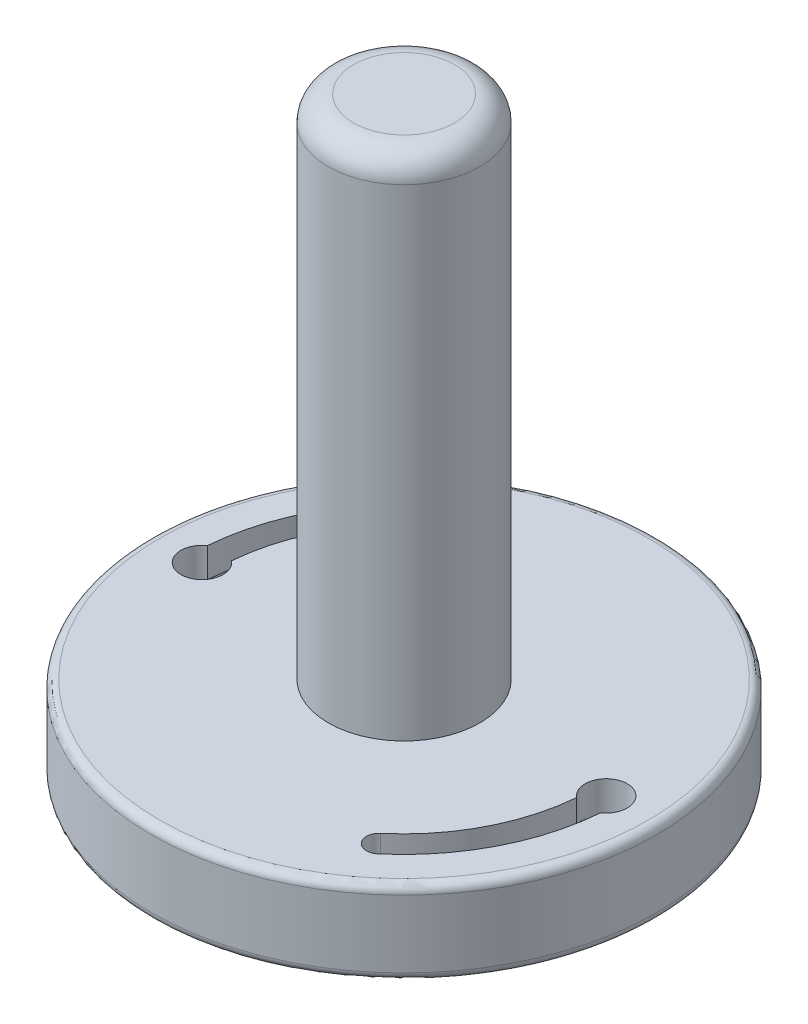
ISO-10303-21;
HEADER;
FILE_DESCRIPTION(('STEP AP214'),'2;1');
FILE_NAME('part.step','',(''),(''),'','','');
FILE_SCHEMA(('AUTOMOTIVE_DESIGN { 1 0 10303 214 1 1 1 1 }'));
ENDSEC;
DATA;
#1=APPLICATION_CONTEXT('core data for automotive mechanical design processes');
#2=APPLICATION_PROTOCOL_DEFINITION('international standard','automotive_design',2000,#1);
#3=PRODUCT_CONTEXT('',#1,'mechanical');
#4=PRODUCT('Part','Part','',(#3));
#5=PRODUCT_RELATED_PRODUCT_CATEGORY('part','',(#4));
#6=PRODUCT_DEFINITION_FORMATION('','',#4);
#7=PRODUCT_DEFINITION_CONTEXT('part definition',#1,'design');
#8=PRODUCT_DEFINITION('design','',#6,#7);
#9=PRODUCT_DEFINITION_SHAPE('','',#8);
#10=(LENGTH_UNIT() NAMED_UNIT(*) SI_UNIT(.MILLI.,.METRE.));
#11=(NAMED_UNIT(*) PLANE_ANGLE_UNIT() SI_UNIT($,.RADIAN.));
#12=(NAMED_UNIT(*) SI_UNIT($,.STERADIAN.) SOLID_ANGLE_UNIT());
#13=UNCERTAINTY_MEASURE_WITH_UNIT(LENGTH_MEASURE(1.E-05),#10,'distance_accuracy_value','');
#14=(GEOMETRIC_REPRESENTATION_CONTEXT(3) GLOBAL_UNCERTAINTY_ASSIGNED_CONTEXT((#13)) GLOBAL_UNIT_ASSIGNED_CONTEXT((#10,
#11,#12)) REPRESENTATION_CONTEXT('',''));
#15=CARTESIAN_POINT('',(0.,0.,0.));
#16=DIRECTION('',(0.,0.,1.));
#17=DIRECTION('',(1.,0.,0.));
#18=AXIS2_PLACEMENT_3D('',#15,#16,#17);
#19=CARTESIAN_POINT('',(0.,12.7,0.));
#20=DIRECTION('',(0.,-1.,0.));
#21=DIRECTION('',(0.,0.,-1.));
#22=AXIS2_PLACEMENT_3D('',#19,#20,#21);
#23=CYLINDRICAL_SURFACE('',#22,38.1);
#24=CARTESIAN_POINT('',(0.,1.27,0.));
#25=DIRECTION('',(0.,1.,0.));
#26=DIRECTION('',(0.,0.,1.));
#27=AXIS2_PLACEMENT_3D('',#24,#25,#26);
#28=CIRCLE('',#27,38.1);
#29=CARTESIAN_POINT('',(0.,1.27,38.1));
#30=VERTEX_POINT('',#29);
#31=EDGE_CURVE('E284',#30,#30,#28,.T.);
#32=ORIENTED_EDGE('',*,*,#31,.T.);
#33=EDGE_LOOP('',(#32));
#34=FACE_BOUND('',#33,.T.);
#35=CARTESIAN_POINT('',(0.,11.43,0.));
#36=DIRECTION('',(0.,1.,0.));
#37=DIRECTION('',(0.,0.,1.));
#38=AXIS2_PLACEMENT_3D('',#35,#36,#37);
#39=CIRCLE('',#38,38.1);
#40=CARTESIAN_POINT('',(0.,11.43,38.1));
#41=VERTEX_POINT('',#40);
#42=EDGE_CURVE('E281',#41,#41,#39,.F.);
#43=ORIENTED_EDGE('',*,*,#42,.T.);
#44=EDGE_LOOP('',(#43));
#45=FACE_BOUND('',#44,.T.);
#46=ADVANCED_FACE('F35',(#34,#45),#23,.T.);
#47=CARTESIAN_POINT('',(0.,12.7,0.));
#48=DIRECTION('',(0.,1.,0.));
#49=DIRECTION('',(0.,0.,1.));
#50=AXIS2_PLACEMENT_3D('',#47,#48,#49);
#51=PLANE('',#50);
#52=CARTESIAN_POINT('',(0.,12.7,0.));
#53=DIRECTION('',(0.,1.,0.));
#54=DIRECTION('',(0.,0.,1.));
#55=AXIS2_PLACEMENT_3D('',#52,#53,#54);
#56=CIRCLE('',#55,32.385);
#57=CARTESIAN_POINT('',(20.8166767396913,12.7,24.8083492904142));
#58=VERTEX_POINT('',#57);
#59=CARTESIAN_POINT('',(32.2791666666659,12.7,2.61603216830468));
#60=VERTEX_POINT('',#59);
#61=EDGE_CURVE('E50',#58,#60,#56,.T.);
#62=ORIENTED_EDGE('',*,*,#61,.F.);
#63=CARTESIAN_POINT('',(19.5921663432389,12.7,23.3490346262722));
#64=DIRECTION('',(0.,1.,0.));
#65=DIRECTION('',(0.,0.,1.));
#66=AXIS2_PLACEMENT_3D('',#63,#64,#65);
#67=CIRCLE('',#66,1.905);
#68=CARTESIAN_POINT('',(18.3676559467864,12.7,21.8897199621302));
#69=VERTEX_POINT('',#68);
#70=EDGE_CURVE('E225',#69,#58,#67,.T.);
#71=ORIENTED_EDGE('',*,*,#70,.F.);
#72=CARTESIAN_POINT('',(0.,12.7,0.));
#73=DIRECTION('',(0.,-1.,0.));
#74=DIRECTION('',(0.,0.,1.));
#75=AXIS2_PLACEMENT_3D('',#72,#73,#74);
#76=CIRCLE('',#75,28.575);
#77=CARTESIAN_POINT('',(28.4691666666659,12.7,2.45706619886328));
#78=VERTEX_POINT('',#77);
#79=EDGE_CURVE('E236',#78,#69,#76,.T.);
#80=ORIENTED_EDGE('',*,*,#79,.F.);
#81=CARTESIAN_POINT('',(30.48,12.7,8.88324318369062E-12));
#82=DIRECTION('',(0.,1.,0.));
#83=DIRECTION('',(0.,0.,1.));
#84=AXIS2_PLACEMENT_3D('',#81,#82,#83);
#85=CIRCLE('',#84,3.17500000000002);
#86=EDGE_CURVE('E234',#60,#78,#85,.T.);
#87=ORIENTED_EDGE('',*,*,#86,.F.);
#88=EDGE_LOOP('',(#62,#71,#80,#87));
#89=FACE_BOUND('',#88,.T.);
#90=CARTESIAN_POINT('',(0.,12.7,0.));
#91=DIRECTION('',(0.,1.,0.));
#92=DIRECTION('',(0.,0.,1.));
#93=AXIS2_PLACEMENT_3D('',#90,#91,#92);
#94=CIRCLE('',#93,32.385);
#95=CARTESIAN_POINT('',(-20.8166767396985,12.7,-24.8083492904081));
#96=VERTEX_POINT('',#95);
#97=CARTESIAN_POINT('',(-32.2791666666667,12.7,-2.61603216829525));
#98=VERTEX_POINT('',#97);
#99=EDGE_CURVE('E58',#96,#98,#94,.T.);
#100=ORIENTED_EDGE('',*,*,#99,.F.);
#101=CARTESIAN_POINT('',(-19.5921663432457,12.7,-23.3490346262665));
#102=DIRECTION('',(0.,1.,0.));
#103=DIRECTION('',(0.,0.,1.));
#104=AXIS2_PLACEMENT_3D('',#101,#102,#103);
#105=CIRCLE('',#104,1.905);
#106=CARTESIAN_POINT('',(-18.3676559467928,12.7,-21.8897199621248));
#107=VERTEX_POINT('',#106);
#108=EDGE_CURVE('E251',#107,#96,#105,.T.);
#109=ORIENTED_EDGE('',*,*,#108,.F.);
#110=CARTESIAN_POINT('',(0.,12.7,0.));
#111=DIRECTION('',(0.,-1.,0.));
#112=DIRECTION('',(0.,0.,1.));
#113=AXIS2_PLACEMENT_3D('',#110,#111,#112);
#114=CIRCLE('',#113,28.575);
#115=CARTESIAN_POINT('',(-28.4691666666667,12.7,-2.45706619885496));
#116=VERTEX_POINT('',#115);
#117=EDGE_CURVE('E263',#116,#107,#114,.T.);
#118=ORIENTED_EDGE('',*,*,#117,.F.);
#119=CARTESIAN_POINT('',(-30.48,12.7,0.));
#120=DIRECTION('',(0.,1.,0.));
#121=DIRECTION('',(0.,0.,1.));
#122=AXIS2_PLACEMENT_3D('',#119,#120,#121);
#123=CIRCLE('',#122,3.17499999999999);
#124=EDGE_CURVE('E260',#98,#116,#123,.T.);
#125=ORIENTED_EDGE('',*,*,#124,.F.);
#126=EDGE_LOOP('',(#100,#109,#118,#125));
#127=FACE_BOUND('',#126,.T.);
#128=CARTESIAN_POINT('',(0.,12.7,0.));
#129=DIRECTION('',(0.,1.,0.));
#130=DIRECTION('',(0.,0.,1.));
#131=AXIS2_PLACEMENT_3D('',#128,#129,#130);
#132=CIRCLE('',#131,36.83);
#133=CARTESIAN_POINT('',(0.,12.7,36.83));
#134=VERTEX_POINT('',#133);
#135=EDGE_CURVE('E278',#134,#134,#132,.T.);
#136=ORIENTED_EDGE('',*,*,#135,.T.);
#137=EDGE_LOOP('',(#136));
#138=FACE_BOUND('',#137,.T.);
#139=CARTESIAN_POINT('',(0.,12.7,0.));
#140=DIRECTION('',(0.,1.,0.));
#141=DIRECTION('',(0.,0.,1.));
#142=AXIS2_PLACEMENT_3D('',#139,#140,#141);
#143=CIRCLE('',#142,11.43);
#144=CARTESIAN_POINT('',(0.,12.7,11.43));
#145=VERTEX_POINT('',#144);
#146=EDGE_CURVE('E270',#145,#145,#143,.T.);
#147=ORIENTED_EDGE('',*,*,#146,.F.);
#148=EDGE_LOOP('',(#147));
#149=FACE_BOUND('',#148,.T.);
#150=ADVANCED_FACE('F308',(#89,#127,#138,#149),#51,.T.);
#151=CARTESIAN_POINT('',(0.,0.,0.));
#152=DIRECTION('',(0.,1.,0.));
#153=DIRECTION('',(0.,0.,1.));
#154=AXIS2_PLACEMENT_3D('',#151,#152,#153);
#155=PLANE('',#154);
#156=CARTESIAN_POINT('',(0.,0.,0.));
#157=DIRECTION('',(0.,1.,0.));
#158=DIRECTION('',(0.,0.,1.));
#159=AXIS2_PLACEMENT_3D('',#156,#157,#158);
#160=CIRCLE('',#159,36.83);
#161=CARTESIAN_POINT('',(0.,0.,36.83));
#162=VERTEX_POINT('',#161);
#163=EDGE_CURVE('E287',#162,#162,#160,.F.);
#164=ORIENTED_EDGE('',*,*,#163,.T.);
#165=EDGE_LOOP('',(#164));
#166=FACE_BOUND('',#165,.T.);
#167=ADVANCED_FACE('F314',(#166),#155,.F.);
#168=CARTESIAN_POINT('',(0.,89.154,0.));
#169=DIRECTION('',(0.,-1.,0.));
#170=DIRECTION('',(0.,0.,-1.));
#171=AXIS2_PLACEMENT_3D('',#168,#169,#170);
#172=CYLINDRICAL_SURFACE('',#171,11.43);
#173=CARTESIAN_POINT('',(0.,85.344,0.));
#174=DIRECTION('',(0.,1.,0.));
#175=DIRECTION('',(0.,0.,1.));
#176=AXIS2_PLACEMENT_3D('',#173,#174,#175);
#177=CIRCLE('',#176,11.43);
#178=CARTESIAN_POINT('',(0.,85.344,11.43));
#179=VERTEX_POINT('',#178);
#180=EDGE_CURVE('E11',#179,#179,#177,.F.);
#181=ORIENTED_EDGE('',*,*,#180,.T.);
#182=EDGE_LOOP('',(#181));
#183=FACE_BOUND('',#182,.T.);
#184=ORIENTED_EDGE('',*,*,#146,.T.);
#185=EDGE_LOOP('',(#184));
#186=FACE_BOUND('',#185,.T.);
#187=ADVANCED_FACE('F325',(#183,#186),#172,.T.);
#188=CARTESIAN_POINT('',(0.,89.154,0.));
#189=DIRECTION('',(0.,1.,0.));
#190=DIRECTION('',(0.,0.,1.));
#191=AXIS2_PLACEMENT_3D('',#188,#189,#190);
#192=PLANE('',#191);
#193=CARTESIAN_POINT('',(0.,89.154,0.));
#194=DIRECTION('',(0.,1.,0.));
#195=DIRECTION('',(0.,0.,1.));
#196=AXIS2_PLACEMENT_3D('',#193,#194,#195);
#197=CIRCLE('',#196,7.62);
#198=CARTESIAN_POINT('',(0.,89.154,7.62));
#199=VERTEX_POINT('',#198);
#200=EDGE_CURVE('E43',#199,#199,#197,.T.);
#201=ORIENTED_EDGE('',*,*,#200,.T.);
#202=EDGE_LOOP('',(#201));
#203=FACE_BOUND('',#202,.T.);
#204=ADVANCED_FACE('F292',(#203),#192,.T.);
#205=CARTESIAN_POINT('',(0.,11.43,0.));
#206=DIRECTION('',(0.,1.,0.));
#207=DIRECTION('',(0.,0.,1.));
#208=AXIS2_PLACEMENT_3D('',#205,#206,#207);
#209=TOROIDAL_SURFACE('',#208,36.83,1.27);
#210=ORIENTED_EDGE('',*,*,#42,.F.);
#211=EDGE_LOOP('',(#210));
#212=FACE_BOUND('',#211,.T.);
#213=ORIENTED_EDGE('',*,*,#135,.F.);
#214=EDGE_LOOP('',(#213));
#215=FACE_BOUND('',#214,.T.);
#216=ADVANCED_FACE('F304',(#212,#215),#209,.T.);
#217=CARTESIAN_POINT('',(0.,1.27,0.));
#218=DIRECTION('',(0.,1.,0.));
#219=DIRECTION('',(0.,0.,1.));
#220=AXIS2_PLACEMENT_3D('',#217,#218,#219);
#221=TOROIDAL_SURFACE('',#220,36.83,1.27);
#222=ORIENTED_EDGE('',*,*,#163,.F.);
#223=EDGE_LOOP('',(#222));
#224=FACE_BOUND('',#223,.T.);
#225=ORIENTED_EDGE('',*,*,#31,.F.);
#226=EDGE_LOOP('',(#225));
#227=FACE_BOUND('',#226,.T.);
#228=ADVANCED_FACE('F296',(#224,#227),#221,.T.);
#229=CARTESIAN_POINT('',(0.,85.344,0.));
#230=DIRECTION('',(0.,1.,0.));
#231=DIRECTION('',(0.,0.,1.));
#232=AXIS2_PLACEMENT_3D('',#229,#230,#231);
#233=TOROIDAL_SURFACE('',#232,7.62,3.81);
#234=ORIENTED_EDGE('',*,*,#180,.F.);
#235=EDGE_LOOP('',(#234));
#236=FACE_BOUND('',#235,.T.);
#237=ORIENTED_EDGE('',*,*,#200,.F.);
#238=EDGE_LOOP('',(#237));
#239=FACE_BOUND('',#238,.T.);
#240=ADVANCED_FACE('F37',(#236,#239),#233,.T.);
#241=CARTESIAN_POINT('',(0.,8.255,0.));
#242=DIRECTION('',(0.,1.,0.));
#243=DIRECTION('',(0.,0.,1.));
#244=AXIS2_PLACEMENT_3D('',#241,#242,#243);
#245=CYLINDRICAL_SURFACE('',#244,32.385);
#246=ORIENTED_EDGE('',*,*,#99,.T.);
#247=DIRECTION('',(0.,1.,0.));
#248=VECTOR('',#247,1.);
#249=CARTESIAN_POINT('',(-32.2791666666667,8.255,-2.61603216829525));
#250=LINE('',#249,#248);
#251=CARTESIAN_POINT('',(-32.2791666666667,8.255,-2.61603216829525));
#252=VERTEX_POINT('',#251);
#253=EDGE_CURVE('E258',#252,#98,#250,.T.);
#254=ORIENTED_EDGE('',*,*,#253,.F.);
#255=CARTESIAN_POINT('',(0.,8.255,0.));
#256=DIRECTION('',(0.,1.,0.));
#257=DIRECTION('',(0.,0.,1.));
#258=AXIS2_PLACEMENT_3D('',#255,#256,#257);
#259=CIRCLE('',#258,32.385);
#260=CARTESIAN_POINT('',(-20.8166767396985,8.255,-24.8083492904081));
#261=VERTEX_POINT('',#260);
#262=EDGE_CURVE('E248',#261,#252,#259,.T.);
#263=ORIENTED_EDGE('',*,*,#262,.F.);
#264=DIRECTION('',(0.,1.,0.));
#265=VECTOR('',#264,1.);
#266=CARTESIAN_POINT('',(-20.8166767396985,8.255,-24.8083492904081));
#267=LINE('',#266,#265);
#268=EDGE_CURVE('E268',#261,#96,#267,.T.);
#269=ORIENTED_EDGE('',*,*,#268,.T.);
#270=EDGE_LOOP('',(#246,#254,#263,#269));
#271=FACE_BOUND('',#270,.T.);
#272=ADVANCED_FACE('F295',(#271),#245,.F.);
#273=CARTESIAN_POINT('',(-19.5921663432457,8.255,-23.3490346262665));
#274=DIRECTION('',(0.,1.,0.));
#275=DIRECTION('',(0.,0.,1.));
#276=AXIS2_PLACEMENT_3D('',#273,#274,#275);
#277=CYLINDRICAL_SURFACE('',#276,1.905);
#278=ORIENTED_EDGE('',*,*,#108,.T.);
#279=ORIENTED_EDGE('',*,*,#268,.F.);
#280=CARTESIAN_POINT('',(-19.5921663432457,8.255,-23.3490346262665));
#281=DIRECTION('',(0.,1.,0.));
#282=DIRECTION('',(0.,0.,1.));
#283=AXIS2_PLACEMENT_3D('',#280,#281,#282);
#284=CIRCLE('',#283,1.905);
#285=CARTESIAN_POINT('',(-18.3676559467928,8.255,-21.8897199621248));
#286=VERTEX_POINT('',#285);
#287=EDGE_CURVE('E256',#286,#261,#284,.T.);
#288=ORIENTED_EDGE('',*,*,#287,.F.);
#289=DIRECTION('',(0.,1.,0.));
#290=VECTOR('',#289,1.);
#291=CARTESIAN_POINT('',(-18.3676559467928,8.255,-21.8897199621248));
#292=LINE('',#291,#290);
#293=EDGE_CURVE('E271',#286,#107,#292,.T.);
#294=ORIENTED_EDGE('',*,*,#293,.T.);
#295=EDGE_LOOP('',(#278,#279,#288,#294));
#296=FACE_BOUND('',#295,.T.);
#297=ADVANCED_FACE('F302',(#296),#277,.F.);
#298=CARTESIAN_POINT('',(0.,8.255,0.));
#299=DIRECTION('',(0.,1.,0.));
#300=DIRECTION('',(0.,0.,1.));
#301=AXIS2_PLACEMENT_3D('',#298,#299,#300);
#302=CYLINDRICAL_SURFACE('',#301,28.575);
#303=ORIENTED_EDGE('',*,*,#117,.T.);
#304=ORIENTED_EDGE('',*,*,#293,.F.);
#305=CARTESIAN_POINT('',(0.,8.255,0.));
#306=DIRECTION('',(0.,-1.,0.));
#307=DIRECTION('',(0.,0.,1.));
#308=AXIS2_PLACEMENT_3D('',#305,#306,#307);
#309=CIRCLE('',#308,28.575);
#310=CARTESIAN_POINT('',(-28.4691666666667,8.255,-2.45706619885496));
#311=VERTEX_POINT('',#310);
#312=EDGE_CURVE('E254',#311,#286,#309,.T.);
#313=ORIENTED_EDGE('',*,*,#312,.F.);
#314=DIRECTION('',(0.,1.,0.));
#315=VECTOR('',#314,1.);
#316=CARTESIAN_POINT('',(-28.4691666666667,8.255,-2.45706619885496));
#317=LINE('',#316,#315);
#318=EDGE_CURVE('E273',#311,#116,#317,.T.);
#319=ORIENTED_EDGE('',*,*,#318,.T.);
#320=EDGE_LOOP('',(#303,#304,#313,#319));
#321=FACE_BOUND('',#320,.T.);
#322=ADVANCED_FACE('F346',(#321),#302,.T.);
#323=CARTESIAN_POINT('',(-30.48,8.255,0.));
#324=DIRECTION('',(0.,1.,0.));
#325=DIRECTION('',(0.,0.,1.));
#326=AXIS2_PLACEMENT_3D('',#323,#324,#325);
#327=CYLINDRICAL_SURFACE('',#326,3.17499999999999);
#328=ORIENTED_EDGE('',*,*,#124,.T.);
#329=ORIENTED_EDGE('',*,*,#318,.F.);
#330=CARTESIAN_POINT('',(-30.48,8.255,0.));
#331=DIRECTION('',(0.,1.,0.));
#332=DIRECTION('',(0.,0.,1.));
#333=AXIS2_PLACEMENT_3D('',#330,#331,#332);
#334=CIRCLE('',#333,3.17499999999999);
#335=CARTESIAN_POINT('',(-27.305,8.255,0.));
#336=VERTEX_POINT('',#335);
#337=EDGE_CURVE('E250',#336,#311,#334,.T.);
#338=ORIENTED_EDGE('',*,*,#337,.F.);
#339=DIRECTION('',(0.,1.,0.));
#340=VECTOR('',#339,1.);
#341=CARTESIAN_POINT('',(-27.305,5.08,0.));
#342=LINE('',#341,#340);
#343=CARTESIAN_POINT('',(-27.305,5.08,0.));
#344=VERTEX_POINT('',#343);
#345=EDGE_CURVE('E206',#344,#336,#342,.T.);
#346=ORIENTED_EDGE('',*,*,#345,.F.);
#347=CARTESIAN_POINT('',(-30.48,5.08,0.));
#348=DIRECTION('',(0.,1.,0.));
#349=DIRECTION('',(0.,0.,1.));
#350=AXIS2_PLACEMENT_3D('',#347,#348,#349);
#351=CIRCLE('',#350,3.17500000000004);
#352=CARTESIAN_POINT('',(-33.655,5.08,0.));
#353=VERTEX_POINT('',#352);
#354=EDGE_CURVE('E193',#353,#344,#351,.T.);
#355=ORIENTED_EDGE('',*,*,#354,.F.);
#356=DIRECTION('',(0.,1.,0.));
#357=VECTOR('',#356,1.);
#358=CARTESIAN_POINT('',(-33.655,5.08,0.));
#359=LINE('',#358,#357);
#360=CARTESIAN_POINT('',(-33.655,8.255,0.));
#361=VERTEX_POINT('',#360);
#362=EDGE_CURVE('E214',#353,#361,#359,.T.);
#363=ORIENTED_EDGE('',*,*,#362,.T.);
#364=EDGE_CURVE('E252',#252,#361,#334,.T.);
#365=ORIENTED_EDGE('',*,*,#364,.F.);
#366=ORIENTED_EDGE('',*,*,#253,.T.);
#367=EDGE_LOOP('',(#328,#329,#338,#346,#355,#363,#365,#366));
#368=FACE_BOUND('',#367,.T.);
#369=ADVANCED_FACE('F342',(#368),#327,.F.);
#370=CARTESIAN_POINT('',(0.,8.255,0.));
#371=DIRECTION('',(0.,1.,0.));
#372=DIRECTION('',(0.,0.,1.));
#373=AXIS2_PLACEMENT_3D('',#370,#371,#372);
#374=CYLINDRICAL_SURFACE('',#373,32.385);
#375=ORIENTED_EDGE('',*,*,#61,.T.);
#376=DIRECTION('',(0.,1.,0.));
#377=VECTOR('',#376,1.);
#378=CARTESIAN_POINT('',(32.2791666666659,8.255,2.61603216830468));
#379=LINE('',#378,#377);
#380=CARTESIAN_POINT('',(32.2791666666659,8.255,2.61603216830468));
#381=VERTEX_POINT('',#380);
#382=EDGE_CURVE('E232',#381,#60,#379,.T.);
#383=ORIENTED_EDGE('',*,*,#382,.F.);
#384=CARTESIAN_POINT('',(0.,8.255,0.));
#385=DIRECTION('',(0.,1.,0.));
#386=DIRECTION('',(0.,0.,1.));
#387=AXIS2_PLACEMENT_3D('',#384,#385,#386);
#388=CIRCLE('',#387,32.385);
#389=CARTESIAN_POINT('',(20.8166767396913,8.255,24.8083492904142));
#390=VERTEX_POINT('',#389);
#391=EDGE_CURVE('E222',#390,#381,#388,.T.);
#392=ORIENTED_EDGE('',*,*,#391,.F.);
#393=DIRECTION('',(0.,1.,0.));
#394=VECTOR('',#393,1.);
#395=CARTESIAN_POINT('',(20.8166767396913,8.255,24.8083492904142));
#396=LINE('',#395,#394);
#397=EDGE_CURVE('E241',#390,#58,#396,.T.);
#398=ORIENTED_EDGE('',*,*,#397,.T.);
#399=EDGE_LOOP('',(#375,#383,#392,#398));
#400=FACE_BOUND('',#399,.T.);
#401=ADVANCED_FACE('F345',(#400),#374,.F.);
#402=CARTESIAN_POINT('',(19.5921663432389,8.255,23.3490346262722));
#403=DIRECTION('',(0.,1.,0.));
#404=DIRECTION('',(0.,0.,1.));
#405=AXIS2_PLACEMENT_3D('',#402,#403,#404);
#406=CYLINDRICAL_SURFACE('',#405,1.905);
#407=ORIENTED_EDGE('',*,*,#70,.T.);
#408=ORIENTED_EDGE('',*,*,#397,.F.);
#409=CARTESIAN_POINT('',(19.5921663432389,8.255,23.3490346262722));
#410=DIRECTION('',(0.,1.,0.));
#411=DIRECTION('',(0.,0.,1.));
#412=AXIS2_PLACEMENT_3D('',#409,#410,#411);
#413=CIRCLE('',#412,1.905);
#414=CARTESIAN_POINT('',(18.3676559467864,8.255,21.8897199621302));
#415=VERTEX_POINT('',#414);
#416=EDGE_CURVE('E230',#415,#390,#413,.T.);
#417=ORIENTED_EDGE('',*,*,#416,.F.);
#418=DIRECTION('',(0.,1.,0.));
#419=VECTOR('',#418,1.);
#420=CARTESIAN_POINT('',(18.3676559467864,8.255,21.8897199621302));
#421=LINE('',#420,#419);
#422=EDGE_CURVE('E243',#415,#69,#421,.T.);
#423=ORIENTED_EDGE('',*,*,#422,.T.);
#424=EDGE_LOOP('',(#407,#408,#417,#423));
#425=FACE_BOUND('',#424,.T.);
#426=ADVANCED_FACE('F356',(#425),#406,.F.);
#427=CARTESIAN_POINT('',(0.,8.255,0.));
#428=DIRECTION('',(0.,1.,0.));
#429=DIRECTION('',(0.,0.,1.));
#430=AXIS2_PLACEMENT_3D('',#427,#428,#429);
#431=CYLINDRICAL_SURFACE('',#430,28.575);
#432=ORIENTED_EDGE('',*,*,#79,.T.);
#433=ORIENTED_EDGE('',*,*,#422,.F.);
#434=CARTESIAN_POINT('',(0.,8.255,0.));
#435=DIRECTION('',(0.,-1.,0.));
#436=DIRECTION('',(0.,0.,1.));
#437=AXIS2_PLACEMENT_3D('',#434,#435,#436);
#438=CIRCLE('',#437,28.575);
#439=CARTESIAN_POINT('',(28.4691666666659,8.255,2.45706619886328));
#440=VERTEX_POINT('',#439);
#441=EDGE_CURVE('E228',#440,#415,#438,.T.);
#442=ORIENTED_EDGE('',*,*,#441,.F.);
#443=DIRECTION('',(0.,1.,0.));
#444=VECTOR('',#443,1.);
#445=CARTESIAN_POINT('',(28.4691666666659,8.255,2.45706619886328));
#446=LINE('',#445,#444);
#447=EDGE_CURVE('E245',#440,#78,#446,.T.);
#448=ORIENTED_EDGE('',*,*,#447,.T.);
#449=EDGE_LOOP('',(#432,#433,#442,#448));
#450=FACE_BOUND('',#449,.T.);
#451=ADVANCED_FACE('F360',(#450),#431,.T.);
#452=CARTESIAN_POINT('',(30.48,8.255,8.88324318369062E-12));
#453=DIRECTION('',(0.,1.,0.));
#454=DIRECTION('',(0.,0.,1.));
#455=AXIS2_PLACEMENT_3D('',#452,#453,#454);
#456=CYLINDRICAL_SURFACE('',#455,3.17500000000002);
#457=ORIENTED_EDGE('',*,*,#86,.T.);
#458=ORIENTED_EDGE('',*,*,#447,.F.);
#459=CARTESIAN_POINT('',(30.48,8.255,8.88324318369062E-12));
#460=DIRECTION('',(0.,1.,0.));
#461=DIRECTION('',(0.,0.,1.));
#462=AXIS2_PLACEMENT_3D('',#459,#460,#461);
#463=CIRCLE('',#462,3.17500000000002);
#464=CARTESIAN_POINT('',(27.305,8.255,1.896977325174E-13));
#465=VERTEX_POINT('',#464);
#466=EDGE_CURVE('E224',#465,#440,#463,.T.);
#467=ORIENTED_EDGE('',*,*,#466,.F.);
#468=DIRECTION('',(0.,1.,0.));
#469=VECTOR('',#468,1.);
#470=CARTESIAN_POINT('',(27.305,5.08,1.896977325174E-13));
#471=LINE('',#470,#469);
#472=CARTESIAN_POINT('',(27.305,5.08,1.896977325174E-13));
#473=VERTEX_POINT('',#472);
#474=EDGE_CURVE('E161',#473,#465,#471,.T.);
#475=ORIENTED_EDGE('',*,*,#474,.F.);
#476=CARTESIAN_POINT('',(30.48,5.08,2.12840702415877E-13));
#477=DIRECTION('',(0.,1.,0.));
#478=DIRECTION('',(0.,0.,1.));
#479=AXIS2_PLACEMENT_3D('',#476,#477,#478);
#480=CIRCLE('',#479,3.17500000000004);
#481=CARTESIAN_POINT('',(33.655,5.08,2.34889855334989E-13));
#482=VERTEX_POINT('',#481);
#483=EDGE_CURVE('E165',#482,#473,#480,.T.);
#484=ORIENTED_EDGE('',*,*,#483,.F.);
#485=DIRECTION('',(0.,1.,0.));
#486=VECTOR('',#485,1.);
#487=CARTESIAN_POINT('',(33.655,5.08,2.34889855334989E-13));
#488=LINE('',#487,#486);
#489=CARTESIAN_POINT('',(33.655,8.255,2.34889855334989E-13));
#490=VERTEX_POINT('',#489);
#491=EDGE_CURVE('E151',#482,#490,#488,.T.);
#492=ORIENTED_EDGE('',*,*,#491,.T.);
#493=EDGE_CURVE('E226',#381,#490,#463,.T.);
#494=ORIENTED_EDGE('',*,*,#493,.F.);
#495=ORIENTED_EDGE('',*,*,#382,.T.);
#496=EDGE_LOOP('',(#457,#458,#467,#475,#484,#492,#494,#495));
#497=FACE_BOUND('',#496,.T.);
#498=ADVANCED_FACE('F167',(#497),#456,.F.);
#499=CARTESIAN_POINT('',(0.,5.08,0.));
#500=DIRECTION('',(0.,1.,0.));
#501=DIRECTION('',(0.,0.,1.));
#502=AXIS2_PLACEMENT_3D('',#499,#500,#501);
#503=CYLINDRICAL_SURFACE('',#502,33.655);
#504=CARTESIAN_POINT('',(0.,8.255,0.));
#505=DIRECTION('',(0.,1.,0.));
#506=DIRECTION('',(0.,0.,1.));
#507=AXIS2_PLACEMENT_3D('',#504,#505,#506);
#508=CIRCLE('',#507,33.655);
#509=CARTESIAN_POINT('',(-21.6330170040004,8.255,-25.7812257331693));
#510=VERTEX_POINT('',#509);
#511=EDGE_CURVE('E197',#510,#361,#508,.T.);
#512=ORIENTED_EDGE('',*,*,#511,.T.);
#513=ORIENTED_EDGE('',*,*,#362,.F.);
#514=CARTESIAN_POINT('',(0.,5.08,0.));
#515=DIRECTION('',(0.,1.,0.));
#516=DIRECTION('',(0.,0.,1.));
#517=AXIS2_PLACEMENT_3D('',#514,#515,#516);
#518=CIRCLE('',#517,33.655);
#519=CARTESIAN_POINT('',(-21.6330170040004,5.08,-25.7812257331693));
#520=VERTEX_POINT('',#519);
#521=EDGE_CURVE('E203',#520,#353,#518,.T.);
#522=ORIENTED_EDGE('',*,*,#521,.F.);
#523=DIRECTION('',(0.,1.,0.));
#524=VECTOR('',#523,1.);
#525=CARTESIAN_POINT('',(-21.6330170040004,5.08,-25.7812257331693));
#526=LINE('',#525,#524);
#527=EDGE_CURVE('E217',#520,#510,#526,.T.);
#528=ORIENTED_EDGE('',*,*,#527,.T.);
#529=EDGE_LOOP('',(#512,#513,#522,#528));
#530=FACE_BOUND('',#529,.T.);
#531=ADVANCED_FACE('F359',(#530),#503,.F.);
#532=CARTESIAN_POINT('',(-19.5921663432457,5.08,-23.3490346262665));
#533=DIRECTION('',(0.,1.,0.));
#534=DIRECTION('',(0.,0.,1.));
#535=AXIS2_PLACEMENT_3D('',#532,#533,#534);
#536=CYLINDRICAL_SURFACE('',#535,3.175);
#537=CARTESIAN_POINT('',(-19.5921663432457,8.255,-23.3490346262665));
#538=DIRECTION('',(0.,1.,0.));
#539=DIRECTION('',(0.,0.,1.));
#540=AXIS2_PLACEMENT_3D('',#537,#538,#539);
#541=CIRCLE('',#540,3.175);
#542=CARTESIAN_POINT('',(-17.5513156824909,8.255,-20.9168435193637));
#543=VERTEX_POINT('',#542);
#544=EDGE_CURVE('E209',#543,#510,#541,.T.);
#545=ORIENTED_EDGE('',*,*,#544,.T.);
#546=ORIENTED_EDGE('',*,*,#527,.F.);
#547=CARTESIAN_POINT('',(-19.5921663432457,5.08,-23.3490346262665));
#548=DIRECTION('',(0.,1.,0.));
#549=DIRECTION('',(0.,0.,1.));
#550=AXIS2_PLACEMENT_3D('',#547,#548,#549);
#551=CIRCLE('',#550,3.175);
#552=CARTESIAN_POINT('',(-17.5513156824909,5.08,-20.9168435193637));
#553=VERTEX_POINT('',#552);
#554=EDGE_CURVE('E200',#553,#520,#551,.T.);
#555=ORIENTED_EDGE('',*,*,#554,.F.);
#556=DIRECTION('',(0.,1.,0.));
#557=VECTOR('',#556,1.);
#558=CARTESIAN_POINT('',(-17.5513156824909,5.08,-20.9168435193637));
#559=LINE('',#558,#557);
#560=EDGE_CURVE('E219',#553,#543,#559,.T.);
#561=ORIENTED_EDGE('',*,*,#560,.T.);
#562=EDGE_LOOP('',(#545,#546,#555,#561));
#563=FACE_BOUND('',#562,.T.);
#564=ADVANCED_FACE('F371',(#563),#536,.F.);
#565=CARTESIAN_POINT('',(0.,5.08,0.));
#566=DIRECTION('',(0.,1.,0.));
#567=DIRECTION('',(0.,0.,1.));
#568=AXIS2_PLACEMENT_3D('',#565,#566,#567);
#569=CYLINDRICAL_SURFACE('',#568,27.305);
#570=CARTESIAN_POINT('',(0.,8.255,0.));
#571=DIRECTION('',(0.,-1.,0.));
#572=DIRECTION('',(0.,0.,1.));
#573=AXIS2_PLACEMENT_3D('',#570,#571,#572);
#574=CIRCLE('',#573,27.305);
#575=EDGE_CURVE('E189',#336,#543,#574,.T.);
#576=ORIENTED_EDGE('',*,*,#575,.T.);
#577=ORIENTED_EDGE('',*,*,#560,.F.);
#578=CARTESIAN_POINT('',(0.,5.08,0.));
#579=DIRECTION('',(0.,-1.,0.));
#580=DIRECTION('',(0.,0.,1.));
#581=AXIS2_PLACEMENT_3D('',#578,#579,#580);
#582=CIRCLE('',#581,27.305);
#583=EDGE_CURVE('E196',#344,#553,#582,.T.);
#584=ORIENTED_EDGE('',*,*,#583,.F.);
#585=ORIENTED_EDGE('',*,*,#345,.T.);
#586=EDGE_LOOP('',(#576,#577,#584,#585));
#587=FACE_BOUND('',#586,.T.);
#588=ADVANCED_FACE('F367',(#587),#569,.T.);
#589=CARTESIAN_POINT('',(-15.24,5.08,0.));
#590=DIRECTION('',(0.,1.,0.));
#591=DIRECTION('',(0.,0.,1.));
#592=AXIS2_PLACEMENT_3D('',#589,#590,#591);
#593=PLANE('',#592);
#594=ORIENTED_EDGE('',*,*,#354,.T.);
#595=ORIENTED_EDGE('',*,*,#583,.T.);
#596=ORIENTED_EDGE('',*,*,#554,.T.);
#597=ORIENTED_EDGE('',*,*,#521,.T.);
#598=EDGE_LOOP('',(#594,#595,#596,#597));
#599=FACE_BOUND('',#598,.T.);
#600=ADVANCED_FACE('F370',(#599),#593,.T.);
#601=CARTESIAN_POINT('',(-15.24,8.255,0.));
#602=DIRECTION('',(0.,1.,0.));
#603=DIRECTION('',(0.,0.,1.));
#604=AXIS2_PLACEMENT_3D('',#601,#602,#603);
#605=PLANE('',#604);
#606=ORIENTED_EDGE('',*,*,#364,.T.);
#607=ORIENTED_EDGE('',*,*,#511,.F.);
#608=ORIENTED_EDGE('',*,*,#544,.F.);
#609=ORIENTED_EDGE('',*,*,#575,.F.);
#610=ORIENTED_EDGE('',*,*,#337,.T.);
#611=ORIENTED_EDGE('',*,*,#312,.T.);
#612=ORIENTED_EDGE('',*,*,#287,.T.);
#613=ORIENTED_EDGE('',*,*,#262,.T.);
#614=EDGE_LOOP('',(#606,#607,#608,#609,#610,#611,#612,#613));
#615=FACE_BOUND('',#614,.T.);
#616=ADVANCED_FACE('F379',(#615),#605,.F.);
#617=CARTESIAN_POINT('',(0.,5.08,0.));
#618=DIRECTION('',(0.,1.,0.));
#619=DIRECTION('',(0.,0.,1.));
#620=AXIS2_PLACEMENT_3D('',#617,#618,#619);
#621=CYLINDRICAL_SURFACE('',#620,33.655);
#622=CARTESIAN_POINT('',(0.,8.255,0.));
#623=DIRECTION('',(0.,1.,0.));
#624=DIRECTION('',(0.,0.,1.));
#625=AXIS2_PLACEMENT_3D('',#622,#623,#624);
#626=CIRCLE('',#625,33.655);
#627=CARTESIAN_POINT('',(21.6330170040003,8.255,25.7812257331694));
#628=VERTEX_POINT('',#627);
#629=EDGE_CURVE('E158',#628,#490,#626,.T.);
#630=ORIENTED_EDGE('',*,*,#629,.T.);
#631=ORIENTED_EDGE('',*,*,#491,.F.);
#632=CARTESIAN_POINT('',(0.,5.08,0.));
#633=DIRECTION('',(0.,1.,0.));
#634=DIRECTION('',(0.,0.,1.));
#635=AXIS2_PLACEMENT_3D('',#632,#633,#634);
#636=CIRCLE('',#635,33.655);
#637=CARTESIAN_POINT('',(21.6330170040003,5.08,25.7812257331694));
#638=VERTEX_POINT('',#637);
#639=EDGE_CURVE('E155',#638,#482,#636,.T.);
#640=ORIENTED_EDGE('',*,*,#639,.F.);
#641=DIRECTION('',(0.,1.,0.));
#642=VECTOR('',#641,1.);
#643=CARTESIAN_POINT('',(21.6330170040003,5.08,25.7812257331694));
#644=LINE('',#643,#642);
#645=EDGE_CURVE('E187',#638,#628,#644,.T.);
#646=ORIENTED_EDGE('',*,*,#645,.T.);
#647=EDGE_LOOP('',(#630,#631,#640,#646));
#648=FACE_BOUND('',#647,.T.);
#649=ADVANCED_FACE('F153',(#648),#621,.F.);
#650=CARTESIAN_POINT('',(19.5921663432455,5.08,23.3490346262666));
#651=DIRECTION('',(0.,1.,0.));
#652=DIRECTION('',(0.,0.,1.));
#653=AXIS2_PLACEMENT_3D('',#650,#651,#652);
#654=CYLINDRICAL_SURFACE('',#653,3.175);
#655=CARTESIAN_POINT('',(19.5921663432455,8.255,23.3490346262666));
#656=DIRECTION('',(0.,1.,0.));
#657=DIRECTION('',(0.,0.,1.));
#658=AXIS2_PLACEMENT_3D('',#655,#656,#657);
#659=CIRCLE('',#658,3.175);
#660=CARTESIAN_POINT('',(17.5513156824908,8.255,20.9168435193638));
#661=VERTEX_POINT('',#660);
#662=EDGE_CURVE('E176',#661,#628,#659,.T.);
#663=ORIENTED_EDGE('',*,*,#662,.T.);
#664=ORIENTED_EDGE('',*,*,#645,.F.);
#665=CARTESIAN_POINT('',(19.5921663432455,5.08,23.3490346262666));
#666=DIRECTION('',(0.,1.,0.));
#667=DIRECTION('',(0.,0.,1.));
#668=AXIS2_PLACEMENT_3D('',#665,#666,#667);
#669=CIRCLE('',#668,3.175);
#670=CARTESIAN_POINT('',(17.5513156824908,5.08,20.9168435193638));
#671=VERTEX_POINT('',#670);
#672=EDGE_CURVE('E162',#671,#638,#669,.T.);
#673=ORIENTED_EDGE('',*,*,#672,.F.);
#674=DIRECTION('',(0.,1.,0.));
#675=VECTOR('',#674,1.);
#676=CARTESIAN_POINT('',(17.5513156824908,5.08,20.9168435193638));
#677=LINE('',#676,#675);
#678=EDGE_CURVE('E190',#671,#661,#677,.T.);
#679=ORIENTED_EDGE('',*,*,#678,.T.);
#680=EDGE_LOOP('',(#663,#664,#673,#679));
#681=FACE_BOUND('',#680,.T.);
#682=ADVANCED_FACE('F388',(#681),#654,.F.);
#683=CARTESIAN_POINT('',(0.,5.08,0.));
#684=DIRECTION('',(0.,1.,0.));
#685=DIRECTION('',(0.,0.,1.));
#686=AXIS2_PLACEMENT_3D('',#683,#684,#685);
#687=CYLINDRICAL_SURFACE('',#686,27.305);
#688=CARTESIAN_POINT('',(0.,8.255,0.));
#689=DIRECTION('',(0.,-1.,0.));
#690=DIRECTION('',(0.,0.,1.));
#691=AXIS2_PLACEMENT_3D('',#688,#689,#690);
#692=CIRCLE('',#691,27.305);
#693=EDGE_CURVE('E179',#465,#661,#692,.T.);
#694=ORIENTED_EDGE('',*,*,#693,.T.);
#695=ORIENTED_EDGE('',*,*,#678,.F.);
#696=CARTESIAN_POINT('',(0.,5.08,0.));
#697=DIRECTION('',(0.,-1.,0.));
#698=DIRECTION('',(0.,0.,1.));
#699=AXIS2_PLACEMENT_3D('',#696,#697,#698);
#700=CIRCLE('',#699,27.305);
#701=EDGE_CURVE('E172',#473,#671,#700,.T.);
#702=ORIENTED_EDGE('',*,*,#701,.F.);
#703=ORIENTED_EDGE('',*,*,#474,.T.);
#704=EDGE_LOOP('',(#694,#695,#702,#703));
#705=FACE_BOUND('',#704,.T.);
#706=ADVANCED_FACE('F389',(#705),#687,.T.);
#707=CARTESIAN_POINT('',(15.24,5.08,1.06420351207939E-13));
#708=DIRECTION('',(0.,1.,0.));
#709=DIRECTION('',(0.,0.,1.));
#710=AXIS2_PLACEMENT_3D('',#707,#708,#709);
#711=PLANE('',#710);
#712=ORIENTED_EDGE('',*,*,#639,.T.);
#713=ORIENTED_EDGE('',*,*,#483,.T.);
#714=ORIENTED_EDGE('',*,*,#701,.T.);
#715=ORIENTED_EDGE('',*,*,#672,.T.);
#716=EDGE_LOOP('',(#712,#713,#714,#715));
#717=FACE_BOUND('',#716,.T.);
#718=ADVANCED_FACE('F174',(#717),#711,.T.);
#719=CARTESIAN_POINT('',(15.24,8.255,1.06420351207939E-13));
#720=DIRECTION('',(0.,1.,0.));
#721=DIRECTION('',(0.,0.,1.));
#722=AXIS2_PLACEMENT_3D('',#719,#720,#721);
#723=PLANE('',#722);
#724=ORIENTED_EDGE('',*,*,#493,.T.);
#725=ORIENTED_EDGE('',*,*,#629,.F.);
#726=ORIENTED_EDGE('',*,*,#662,.F.);
#727=ORIENTED_EDGE('',*,*,#693,.F.);
#728=ORIENTED_EDGE('',*,*,#466,.T.);
#729=ORIENTED_EDGE('',*,*,#441,.T.);
#730=ORIENTED_EDGE('',*,*,#416,.T.);
#731=ORIENTED_EDGE('',*,*,#391,.T.);
#732=EDGE_LOOP('',(#724,#725,#726,#727,#728,#729,#730,#731));
#733=FACE_BOUND('',#732,.T.);
#734=ADVANCED_FACE('F396',(#733),#723,.F.);
#735=CLOSED_SHELL('',(#46,#150,#167,#187,#204,#216,#228,#240,#272,#297,#322,#369,#401,#426,#451,
#498,#531,#564,#588,#600,#616,#649,#682,#706,#718,#734));
#736=MANIFOLD_SOLID_BREP('B2',#735);
#737=ADVANCED_BREP_SHAPE_REPRESENTATION('',(#18,#736),#14);
#738=SHAPE_DEFINITION_REPRESENTATION(#9,#737);
ENDSEC;
END-ISO-10303-21;
